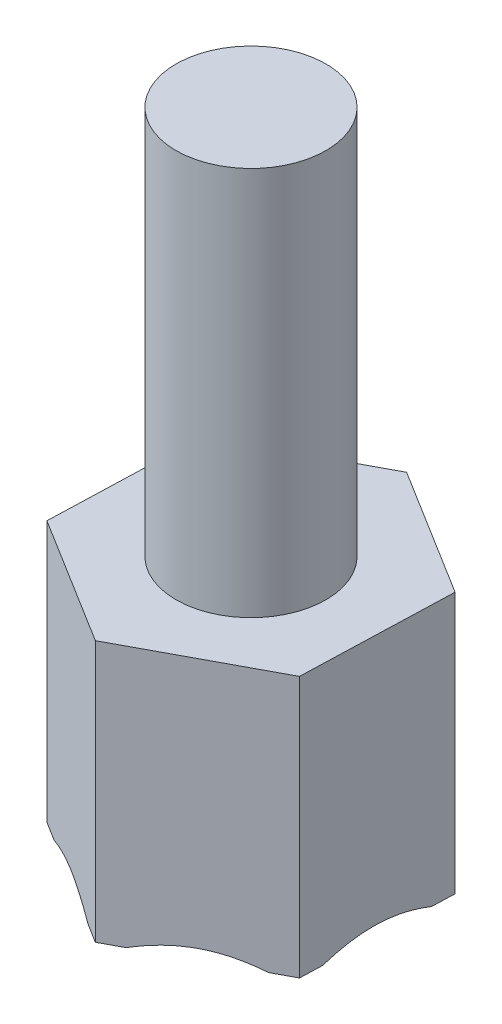
ISO-10303-21;
HEADER;
FILE_DESCRIPTION(('STEP AP214'),'2;1');
FILE_NAME('part.step','',(''),(''),'','','');
FILE_SCHEMA(('AUTOMOTIVE_DESIGN { 1 0 10303 214 1 1 1 1 }'));
ENDSEC;
DATA;
#1=APPLICATION_CONTEXT('core data for automotive mechanical design processes');
#2=APPLICATION_PROTOCOL_DEFINITION('international standard','automotive_design',2000,#1);
#3=PRODUCT_CONTEXT('',#1,'mechanical');
#4=PRODUCT('Part','Part','',(#3));
#5=PRODUCT_RELATED_PRODUCT_CATEGORY('part','',(#4));
#6=PRODUCT_DEFINITION_FORMATION('','',#4);
#7=PRODUCT_DEFINITION_CONTEXT('part definition',#1,'design');
#8=PRODUCT_DEFINITION('design','',#6,#7);
#9=PRODUCT_DEFINITION_SHAPE('','',#8);
#10=(LENGTH_UNIT() NAMED_UNIT(*) SI_UNIT(.MILLI.,.METRE.));
#11=(NAMED_UNIT(*) PLANE_ANGLE_UNIT() SI_UNIT($,.RADIAN.));
#12=(NAMED_UNIT(*) SI_UNIT($,.STERADIAN.) SOLID_ANGLE_UNIT());
#13=UNCERTAINTY_MEASURE_WITH_UNIT(LENGTH_MEASURE(1.E-05),#10,'distance_accuracy_value','');
#14=(GEOMETRIC_REPRESENTATION_CONTEXT(3) GLOBAL_UNCERTAINTY_ASSIGNED_CONTEXT((#13)) GLOBAL_UNIT_ASSIGNED_CONTEXT((#10,
#11,#12)) REPRESENTATION_CONTEXT('',''));
#15=CARTESIAN_POINT('',(0.,0.,0.));
#16=DIRECTION('',(0.,0.,1.));
#17=DIRECTION('',(1.,0.,0.));
#18=AXIS2_PLACEMENT_3D('',#15,#16,#17);
#19=CARTESIAN_POINT('',(2.30462704828819,4.7,1.43248996563041));
#20=DIRECTION('',(0.,1.,0.));
#21=DIRECTION('',(0.,0.,1.));
#22=AXIS2_PLACEMENT_3D('',#19,#20,#21);
#23=PLANE('',#22);
#24=DIRECTION('',(0.881829897555729,0.,-0.471567632240437));
#25=VECTOR('',#24,1.);
#26=CARTESIAN_POINT('',(-0.0882591767581321,4.7,2.71211055288152));
#27=LINE('',#26,#25);
#28=CARTESIAN_POINT('',(-0.0882591767581321,4.7,2.71211055288152));
#29=VERTEX_POINT('',#28);
#30=CARTESIAN_POINT('',(2.30462704828819,4.7,1.43248996563041));
#31=VERTEX_POINT('',#30);
#32=EDGE_CURVE('E159',#29,#31,#27,.T.);
#33=ORIENTED_EDGE('',*,*,#32,.T.);
#34=DIRECTION('',(0.032525399655168,0.,-0.999470909220109));
#35=VECTOR('',#34,1.);
#36=CARTESIAN_POINT('',(2.30462704828819,4.7,1.43248996563041));
#37=LINE('',#36,#35);
#38=CARTESIAN_POINT('',(2.39288622504632,4.7,-1.27962058725112));
#39=VERTEX_POINT('',#38);
#40=EDGE_CURVE('E98',#31,#39,#37,.T.);
#41=ORIENTED_EDGE('',*,*,#40,.T.);
#42=DIRECTION('',(-0.849304497900561,0.,-0.527903276979672));
#43=VECTOR('',#42,1.);
#44=CARTESIAN_POINT('',(2.39288622504632,4.7,-1.27962058725112));
#45=LINE('',#44,#43);
#46=CARTESIAN_POINT('',(0.088259176758134,4.7,-2.71211055288152));
#47=VERTEX_POINT('',#46);
#48=EDGE_CURVE('E114',#39,#47,#45,.T.);
#49=ORIENTED_EDGE('',*,*,#48,.T.);
#50=DIRECTION('',(-0.881829897555729,0.,0.471567632240437));
#51=VECTOR('',#50,1.);
#52=CARTESIAN_POINT('',(0.088259176758134,4.7,-2.71211055288152));
#53=LINE('',#52,#51);
#54=CARTESIAN_POINT('',(-2.30462704828819,4.7,-1.4324899656304));
#55=VERTEX_POINT('',#54);
#56=EDGE_CURVE('E107',#47,#55,#53,.T.);
#57=ORIENTED_EDGE('',*,*,#56,.T.);
#58=DIRECTION('',(-0.0325253996551677,0.,0.999470909220109));
#59=VECTOR('',#58,1.);
#60=CARTESIAN_POINT('',(-2.30462704828819,4.7,-1.4324899656304));
#61=LINE('',#60,#59);
#62=CARTESIAN_POINT('',(-2.39288622504632,4.7,1.27962058725111));
#63=VERTEX_POINT('',#62);
#64=EDGE_CURVE('E111',#55,#63,#61,.T.);
#65=ORIENTED_EDGE('',*,*,#64,.T.);
#66=DIRECTION('',(0.849304497900561,0.,0.527903276979672));
#67=VECTOR('',#66,1.);
#68=CARTESIAN_POINT('',(-2.39288622504632,4.7,1.27962058725111));
#69=LINE('',#68,#67);
#70=EDGE_CURVE('E62',#63,#29,#69,.T.);
#71=ORIENTED_EDGE('',*,*,#70,.T.);
#72=EDGE_LOOP('',(#33,#41,#49,#57,#65,#71));
#73=FACE_BOUND('',#72,.T.);
#74=CARTESIAN_POINT('',(0.,4.7,0.));
#75=DIRECTION('',(0.,1.,0.));
#76=DIRECTION('',(0.,0.,1.));
#77=AXIS2_PLACEMENT_3D('',#74,#75,#76);
#78=CIRCLE('',#77,1.35);
#79=CARTESIAN_POINT('',(0.,4.7,1.35));
#80=VERTEX_POINT('',#79);
#81=EDGE_CURVE('E294',#80,#80,#78,.T.);
#82=ORIENTED_EDGE('',*,*,#81,.F.);
#83=EDGE_LOOP('',(#82));
#84=FACE_BOUND('',#83,.T.);
#85=ADVANCED_FACE('F36',(#73,#84),#23,.T.);
#86=CARTESIAN_POINT('',(2.30462704828819,0.,1.43248996563041));
#87=DIRECTION('',(0.,1.,0.));
#88=DIRECTION('',(0.,0.,1.));
#89=AXIS2_PLACEMENT_3D('',#86,#87,#88);
#90=PLANE('',#89);
#91=DIRECTION('',(0.881829897555729,0.,-0.471567632240437));
#92=VECTOR('',#91,1.);
#93=CARTESIAN_POINT('',(-0.0882591767581321,0.,2.71211055288152));
#94=LINE('',#93,#92);
#95=CARTESIAN_POINT('',(1.94331098636969,0.,1.62570745608024));
#96=VERTEX_POINT('',#95);
#97=CARTESIAN_POINT('',(2.30462704828819,0.,1.43248996563041));
#98=VERTEX_POINT('',#97);
#99=EDGE_CURVE('E143',#96,#98,#94,.T.);
#100=ORIENTED_EDGE('',*,*,#99,.F.);
#101=CARTESIAN_POINT('',(0.,0.,0.));
#102=DIRECTION('',(0.,1.,0.));
#103=DIRECTION('',(0.,0.,1.));
#104=AXIS2_PLACEMENT_3D('',#101,#102,#103);
#105=CIRCLE('',#104,2.53365);
#106=CARTESIAN_POINT('',(2.31795382406241,0.,1.02297233198872));
#107=VERTEX_POINT('',#106);
#108=EDGE_CURVE('E12',#96,#107,#105,.T.);
#109=ORIENTED_EDGE('',*,*,#108,.T.);
#110=DIRECTION('',(0.032525399655168,0.,-0.999470909220109));
#111=VECTOR('',#110,1.);
#112=CARTESIAN_POINT('',(2.30462704828819,0.,1.43248996563041));
#113=LINE('',#112,#111);
#114=EDGE_CURVE('E144',#98,#107,#113,.T.);
#115=ORIENTED_EDGE('',*,*,#114,.F.);
#116=EDGE_LOOP('',(#100,#109,#115));
#117=FACE_BOUND('',#116,.T.);
#118=ADVANCED_FACE('F274',(#117),#90,.F.);
#119=CARTESIAN_POINT('',(2.3795594492721,0.,-0.87010295360943));
#120=VERTEX_POINT('',#119);
#121=CARTESIAN_POINT('',(2.39288622504632,0.,-1.27962058725112));
#122=VERTEX_POINT('',#121);
#123=EDGE_CURVE('E142',#120,#122,#113,.T.);
#124=ORIENTED_EDGE('',*,*,#123,.F.);
#125=CARTESIAN_POINT('',(2.04489693890204,0.,-1.49592073044298));
#126=VERTEX_POINT('',#125);
#127=EDGE_CURVE('E46',#120,#126,#105,.T.);
#128=ORIENTED_EDGE('',*,*,#127,.T.);
#129=DIRECTION('',(-0.849304497900561,0.,-0.527903276979672));
#130=VECTOR('',#129,1.);
#131=CARTESIAN_POINT('',(2.39288622504632,0.,-1.27962058725112));
#132=LINE('',#131,#130);
#133=EDGE_CURVE('E148',#122,#126,#132,.T.);
#134=ORIENTED_EDGE('',*,*,#133,.F.);
#135=EDGE_LOOP('',(#124,#128,#134));
#136=FACE_BOUND('',#135,.T.);
#137=ADVANCED_FACE('F193',(#136),#90,.F.);
#138=CARTESIAN_POINT('',(0.436248462902413,0.,-2.49581040968966));
#139=VERTEX_POINT('',#138);
#140=CARTESIAN_POINT('',(0.088259176758134,0.,-2.71211055288152));
#141=VERTEX_POINT('',#140);
#142=EDGE_CURVE('E147',#139,#141,#132,.T.);
#143=ORIENTED_EDGE('',*,*,#142,.F.);
#144=CARTESIAN_POINT('',(-0.273056885160367,0.,-2.51889306243169));
#145=VERTEX_POINT('',#144);
#146=EDGE_CURVE('E178',#139,#145,#105,.T.);
#147=ORIENTED_EDGE('',*,*,#146,.T.);
#148=DIRECTION('',(-0.881829897555729,0.,0.471567632240437));
#149=VECTOR('',#148,1.);
#150=CARTESIAN_POINT('',(0.088259176758134,0.,-2.71211055288152));
#151=LINE('',#150,#149);
#152=EDGE_CURVE('E151',#141,#145,#151,.T.);
#153=ORIENTED_EDGE('',*,*,#152,.F.);
#154=EDGE_LOOP('',(#143,#147,#153));
#155=FACE_BOUND('',#154,.T.);
#156=ADVANCED_FACE('F365',(#155),#90,.F.);
#157=CARTESIAN_POINT('',(-1.94331098636969,0.,-1.62570745608023));
#158=VERTEX_POINT('',#157);
#159=CARTESIAN_POINT('',(-2.30462704828819,0.,-1.4324899656304));
#160=VERTEX_POINT('',#159);
#161=EDGE_CURVE('E125',#158,#160,#151,.T.);
#162=ORIENTED_EDGE('',*,*,#161,.F.);
#163=CARTESIAN_POINT('',(-2.31795382406241,0.,-1.02297233198872));
#164=VERTEX_POINT('',#163);
#165=EDGE_CURVE('E171',#158,#164,#105,.T.);
#166=ORIENTED_EDGE('',*,*,#165,.T.);
#167=DIRECTION('',(-0.0325253996551677,0.,0.999470909220109));
#168=VECTOR('',#167,1.);
#169=CARTESIAN_POINT('',(-2.30462704828819,0.,-1.4324899656304));
#170=LINE('',#169,#168);
#171=EDGE_CURVE('E154',#160,#164,#170,.T.);
#172=ORIENTED_EDGE('',*,*,#171,.F.);
#173=EDGE_LOOP('',(#162,#166,#172));
#174=FACE_BOUND('',#173,.T.);
#175=ADVANCED_FACE('F359',(#174),#90,.F.);
#176=CARTESIAN_POINT('',(-2.3795594492721,0.,0.870102953609432));
#177=VERTEX_POINT('',#176);
#178=CARTESIAN_POINT('',(-2.39288622504632,0.,1.27962058725111));
#179=VERTEX_POINT('',#178);
#180=EDGE_CURVE('E153',#177,#179,#170,.T.);
#181=ORIENTED_EDGE('',*,*,#180,.F.);
#182=CARTESIAN_POINT('',(-2.04489693890205,0.,1.49592073044297));
#183=VERTEX_POINT('',#182);
#184=EDGE_CURVE('E167',#177,#183,#105,.T.);
#185=ORIENTED_EDGE('',*,*,#184,.T.);
#186=DIRECTION('',(0.849304497900561,0.,0.527903276979672));
#187=VECTOR('',#186,1.);
#188=CARTESIAN_POINT('',(-2.39288622504632,0.,1.27962058725111));
#189=LINE('',#188,#187);
#190=EDGE_CURVE('E156',#179,#183,#189,.T.);
#191=ORIENTED_EDGE('',*,*,#190,.F.);
#192=EDGE_LOOP('',(#181,#185,#191));
#193=FACE_BOUND('',#192,.T.);
#194=ADVANCED_FACE('F275',(#193),#90,.F.);
#195=CARTESIAN_POINT('',(-0.0882591767581321,4.7,2.71211055288152));
#196=DIRECTION('',(-0.471567632240437,0.,-0.881829897555729));
#197=DIRECTION('',(-0.881829897555729,0.,0.471567632240438));
#198=AXIS2_PLACEMENT_3D('',#195,#196,#197);
#199=PLANE('',#198);
#200=CARTESIAN_POINT('',(-0.0882591767581321,0.,2.71211055288152));
#201=VERTEX_POINT('',#200);
#202=CARTESIAN_POINT('',(0.273056885160369,0.,2.51889306243169));
#203=VERTEX_POINT('',#202);
#204=EDGE_CURVE('E139',#201,#203,#94,.T.);
#205=ORIENTED_EDGE('',*,*,#204,.T.);
#206=CARTESIAN_POINT('',(0.272585160907464,-0.000200000000007731,2.51914532184094));
#207=CARTESIAN_POINT('',(0.33941374496188,0.0281606962445841,2.48340804729868));
#208=CARTESIAN_POINT('',(0.407169508592656,0.0539533673700446,2.44717495391573));
#209=CARTESIAN_POINT('',(0.544442305642624,0.0993822849957582,2.3737669099661));
#210=CARTESIAN_POINT('',(0.613963366016231,0.119002770077137,2.336589805944));
#211=CARTESIAN_POINT('',(0.751866766354323,0.150351770559974,2.26284454038247));
#212=CARTESIAN_POINT('',(0.820203310779621,0.162333319790776,2.22630086847993));
#213=CARTESIAN_POINT('',(0.95750326469905,0.178715432857798,2.15287830211427));
#214=CARTESIAN_POINT('',(1.02646577430455,0.183125544334705,2.11599988887589));
#215=CARTESIAN_POINT('',(1.16647929440919,0.184099955451445,2.04112621500703));
#216=CARTESIAN_POINT('',(1.23753169105231,0.180428109206903,2.00313021312177));
#217=CARTESIAN_POINT('',(1.37903638452598,0.165011986207744,1.927459118915));
#218=CARTESIAN_POINT('',(1.4494877388511,0.15325678907638,1.88978453060799));
#219=CARTESIAN_POINT('',(1.59172162468689,0.12187068465535,1.81372349326524));
#220=CARTESIAN_POINT('',(1.66345514284662,0.101961216382188,1.7753632546244));
#221=CARTESIAN_POINT('',(1.80504743431441,0.0555327956966506,1.69964531648686));
#222=CARTESIAN_POINT('',(1.87491065022688,0.0290314007126756,1.66228524126162));
#223=CARTESIAN_POINT('',(1.94378271062257,-0.000200000000000018,1.625455196671));
#224=B_SPLINE_CURVE_WITH_KNOTS('',3,(#206,#207,#208,#209,#210,#211,#212,#213,#214,#215,#216,
#217,#218,#219,#220,#221,#222,#223),.UNSPECIFIED.,.F.,.F.,(4,2,2,2,2,2,2,2,4),(0.,
0.242832593110272,0.486280347118683,0.721175672886601,0.955774575702409,1.19731893403296,
1.4391902546708,1.69012319461926,1.94039480661336),.UNSPECIFIED.);
#225=EDGE_CURVE('E53',#203,#96,#224,.T.);
#226=ORIENTED_EDGE('',*,*,#225,.T.);
#227=ORIENTED_EDGE('',*,*,#99,.T.);
#228=DIRECTION('',(0.,-1.,0.));
#229=VECTOR('',#228,1.);
#230=CARTESIAN_POINT('',(2.30462704828819,4.7,1.43248996563041));
#231=LINE('',#230,#229);
#232=EDGE_CURVE('E165',#31,#98,#231,.T.);
#233=ORIENTED_EDGE('',*,*,#232,.F.);
#234=ORIENTED_EDGE('',*,*,#32,.F.);
#235=DIRECTION('',(0.,-1.,0.));
#236=VECTOR('',#235,1.);
#237=CARTESIAN_POINT('',(-0.0882591767581321,4.7,2.71211055288152));
#238=LINE('',#237,#236);
#239=EDGE_CURVE('E135',#29,#201,#238,.T.);
#240=ORIENTED_EDGE('',*,*,#239,.T.);
#241=EDGE_LOOP('',(#205,#226,#227,#233,#234,#240));
#242=FACE_BOUND('',#241,.T.);
#243=ADVANCED_FACE('F38',(#242),#199,.F.);
#244=CARTESIAN_POINT('',(2.30462704828819,4.7,1.43248996563041));
#245=DIRECTION('',(-0.999470909220109,0.,-0.032525399655168));
#246=DIRECTION('',(-0.032525399655168,0.,0.999470909220109));
#247=AXIS2_PLACEMENT_3D('',#244,#245,#246);
#248=PLANE('',#247);
#249=ORIENTED_EDGE('',*,*,#114,.T.);
#250=CARTESIAN_POINT('',(2.3179364249927,-0.000200000000083292,1.02350698688014));
#251=CARTESIAN_POINT('',(2.32040132940429,0.0281606962445167,0.947763098118933));
#252=CARTESIAN_POINT('',(2.32290043189236,0.0539533673699859,0.870968338870386));
#253=CARTESIAN_POINT('',(2.32796359951483,0.0993822849957162,0.715382587401729));
#254=CARTESIAN_POINT('',(2.33052781317936,0.119002770077103,0.636587031009093));
#255=CARTESIAN_POINT('',(2.3356142399633,0.150351770559952,0.480286550267273));
#256=CARTESIAN_POINT('',(2.33813476396078,0.162333319790758,0.402833530836844));
#257=CARTESIAN_POINT('',(2.34319893323679,0.178715432857789,0.247216999621348));
#258=CARTESIAN_POINT('',(2.34574254532384,0.183125544334702,0.169054507775062));
#259=CARTESIAN_POINT('',(2.35090680173107,0.184099955451452,0.0103624055562354));
#260=CARTESIAN_POINT('',(2.35352749717777,0.180428109206866,-0.0701687758795786));
#261=CARTESIAN_POINT('',(2.35874675399941,0.165011986207525,-0.230550982286859));
#262=CARTESIAN_POINT('',(2.36134528061099,0.153256789076022,-0.31040093901741));
#263=CARTESIAN_POINT('',(2.3665914329519,0.121870684654627,-0.471609616102519));
#264=CARTESIAN_POINT('',(2.36923725087358,0.101961216381232,-0.55291278445259));
#265=CARTESIAN_POINT('',(2.37445973865821,0.0555327956951676,-0.713394274913463));
#266=CARTESIAN_POINT('',(2.37703657238211,0.0290314007108982,-0.792577632296816));
#267=CARTESIAN_POINT('',(2.37957684834198,-0.000200000002091598,-0.870637608506218));
#268=B_SPLINE_CURVE_WITH_KNOTS('',3,(#250,#251,#252,#253,#254,#255,#256,#257,#258,#259,#260,
#261,#262,#263,#264,#265,#266,#267),.UNSPECIFIED.,.F.,.F.,(4,2,2,2,2,2,2,2,4),(0.,
0.242832593110308,0.486280347118756,0.721175672886689,0.955774575702512,1.19731893403451,
1.43919025467382,1.69012319462387,1.94039480661954),.UNSPECIFIED.);
#269=EDGE_CURVE('E205',#107,#120,#268,.T.);
#270=ORIENTED_EDGE('',*,*,#269,.T.);
#271=ORIENTED_EDGE('',*,*,#123,.T.);
#272=DIRECTION('',(0.,-1.,0.));
#273=VECTOR('',#272,1.);
#274=CARTESIAN_POINT('',(2.39288622504632,4.7,-1.27962058725112));
#275=LINE('',#274,#273);
#276=EDGE_CURVE('E163',#39,#122,#275,.T.);
#277=ORIENTED_EDGE('',*,*,#276,.F.);
#278=ORIENTED_EDGE('',*,*,#40,.F.);
#279=ORIENTED_EDGE('',*,*,#232,.T.);
#280=EDGE_LOOP('',(#249,#270,#271,#277,#278,#279));
#281=FACE_BOUND('',#280,.T.);
#282=ADVANCED_FACE('F204',(#281),#248,.F.);
#283=CARTESIAN_POINT('',(2.39288622504632,4.7,-1.27962058725112));
#284=DIRECTION('',(-0.527903276979672,0.,0.849304497900561));
#285=DIRECTION('',(0.849304497900561,0.,0.527903276979672));
#286=AXIS2_PLACEMENT_3D('',#283,#284,#285);
#287=PLANE('',#286);
#288=ORIENTED_EDGE('',*,*,#133,.T.);
#289=CARTESIAN_POINT('',(2.04535126408523,-0.000200000000000078,-1.49563833496101));
#290=CARTESIAN_POINT('',(1.9809875844424,0.0281606962445906,-1.53564494917995));
#291=CARTESIAN_POINT('',(1.9157309232997,0.0539533673700504,-1.57620661504554));
#292=CARTESIAN_POINT('',(1.7835212938722,0.0993822849957628,-1.65838432256454));
#293=CARTESIAN_POINT('',(1.71656444716312,0.119002770077141,-1.70000277493507));
#294=CARTESIAN_POINT('',(1.58374747360897,0.150351770559977,-1.78255799011535));
#295=CARTESIAN_POINT('',(1.51793145318115,0.162333319790778,-1.82346733764323));
#296=CARTESIAN_POINT('',(1.38569566853773,0.178715432857798,-1.90566130249306));
#297=CARTESIAN_POINT('',(1.31927677101928,0.183125544334706,-1.94694538110095));
#298=CARTESIAN_POINT('',(1.18442750732186,0.184099955451445,-2.03076380945043));
#299=CARTESIAN_POINT('',(1.11599580612543,0.180428109206902,-2.0732989890005));
#300=CARTESIAN_POINT('',(0.979710369473362,0.165011986207743,-2.15801010120005));
#301=CARTESIAN_POINT('',(0.911857541759811,0.153256789076378,-2.20018546962311));
#302=CARTESIAN_POINT('',(0.7748698082649,0.121870684655349,-2.28533310936451));
#303=CARTESIAN_POINT('',(0.705782108026837,0.101961216382187,-2.32827603907325));
#304=CARTESIAN_POINT('',(0.569412304343654,0.0555327956966502,-2.41303959139563));
#305=CARTESIAN_POINT('',(0.502125922155066,0.0290314007126754,-2.45486287355328));
#306=CARTESIAN_POINT('',(0.435794137719228,-0.000200000000000016,-2.49609280517162));
#307=B_SPLINE_CURVE_WITH_KNOTS('',3,(#289,#290,#291,#292,#293,#294,#295,#296,#297,#298,#299,
#300,#301,#302,#303,#304,#305,#306),.UNSPECIFIED.,.F.,.F.,(4,2,2,2,2,2,2,2,4),(0.,
0.24283259311027,0.486280347118679,0.721175672886594,0.9557745757024,1.19731893403294,
1.43919025467079,1.69012319461925,1.94039480661334),.UNSPECIFIED.);
#308=EDGE_CURVE('E203',#126,#139,#307,.T.);
#309=ORIENTED_EDGE('',*,*,#308,.T.);
#310=ORIENTED_EDGE('',*,*,#142,.T.);
#311=DIRECTION('',(0.,-1.,0.));
#312=VECTOR('',#311,1.);
#313=CARTESIAN_POINT('',(0.088259176758134,4.7,-2.71211055288152));
#314=LINE('',#313,#312);
#315=EDGE_CURVE('E129',#47,#141,#314,.T.);
#316=ORIENTED_EDGE('',*,*,#315,.F.);
#317=ORIENTED_EDGE('',*,*,#48,.F.);
#318=ORIENTED_EDGE('',*,*,#276,.T.);
#319=EDGE_LOOP('',(#288,#309,#310,#316,#317,#318));
#320=FACE_BOUND('',#319,.T.);
#321=ADVANCED_FACE('F202',(#320),#287,.F.);
#322=CARTESIAN_POINT('',(0.088259176758134,4.7,-2.71211055288152));
#323=DIRECTION('',(0.471567632240437,0.,0.881829897555729));
#324=DIRECTION('',(0.881829897555729,0.,-0.471567632240437));
#325=AXIS2_PLACEMENT_3D('',#322,#323,#324);
#326=PLANE('',#325);
#327=ORIENTED_EDGE('',*,*,#152,.T.);
#328=CARTESIAN_POINT('',(-0.272585160907462,-0.000200000000007842,-2.51914532184094));
#329=CARTESIAN_POINT('',(-0.339413744961878,0.0281606962445838,-2.48340804729868));
#330=CARTESIAN_POINT('',(-0.407169508592654,0.0539533673700445,-2.44717495391574));
#331=CARTESIAN_POINT('',(-0.544442305642622,0.0993822849957586,-2.3737669099661));
#332=CARTESIAN_POINT('',(-0.613963366016229,0.119002770077138,-2.336589805944));
#333=CARTESIAN_POINT('',(-0.75186676635432,0.150351770559975,-2.26284454038247));
#334=CARTESIAN_POINT('',(-0.820203310779619,0.162333319790776,-2.22630086847993));
#335=CARTESIAN_POINT('',(-0.957503264699048,0.178715432857798,-2.15287830211427));
#336=CARTESIAN_POINT('',(-1.02646577430455,0.183125544334706,-2.11599988887589));
#337=CARTESIAN_POINT('',(-1.16647929440919,0.184099955451446,-2.04112621500703));
#338=CARTESIAN_POINT('',(-1.2375316910523,0.180428109206903,-2.00313021312177));
#339=CARTESIAN_POINT('',(-1.37903638452598,0.165011986207745,-1.927459118915));
#340=CARTESIAN_POINT('',(-1.4494877388511,0.15325678907638,-1.88978453060799));
#341=CARTESIAN_POINT('',(-1.59172162468689,0.121870684655351,-1.81372349326524));
#342=CARTESIAN_POINT('',(-1.66345514284662,0.101961216382189,-1.7753632546244));
#343=CARTESIAN_POINT('',(-1.80504743431441,0.0555327956966509,-1.69964531648685));
#344=CARTESIAN_POINT('',(-1.87491065022688,0.0290314007126756,-1.66228524126162));
#345=CARTESIAN_POINT('',(-1.94378271062257,-0.000200000000000048,-1.625455196671));
#346=B_SPLINE_CURVE_WITH_KNOTS('',3,(#328,#329,#330,#331,#332,#333,#334,#335,#336,#337,#338,
#339,#340,#341,#342,#343,#344,#345),.UNSPECIFIED.,.F.,.F.,(4,2,2,2,2,2,2,2,4),(0.,
0.242832593110273,0.486280347118684,0.721175672886602,0.95577457570241,1.19731893403296,
1.43919025467081,1.69012319461927,1.94039480661336),.UNSPECIFIED.);
#347=EDGE_CURVE('E254',#145,#158,#346,.T.);
#348=ORIENTED_EDGE('',*,*,#347,.T.);
#349=ORIENTED_EDGE('',*,*,#161,.T.);
#350=DIRECTION('',(0.,-1.,0.));
#351=VECTOR('',#350,1.);
#352=CARTESIAN_POINT('',(-2.30462704828819,4.7,-1.4324899656304));
#353=LINE('',#352,#351);
#354=EDGE_CURVE('E120',#55,#160,#353,.T.);
#355=ORIENTED_EDGE('',*,*,#354,.F.);
#356=ORIENTED_EDGE('',*,*,#56,.F.);
#357=ORIENTED_EDGE('',*,*,#315,.T.);
#358=EDGE_LOOP('',(#327,#348,#349,#355,#356,#357));
#359=FACE_BOUND('',#358,.T.);
#360=ADVANCED_FACE('F122',(#359),#326,.F.);
#361=CARTESIAN_POINT('',(-2.30462704828819,4.7,-1.4324899656304));
#362=DIRECTION('',(0.999470909220109,0.,0.0325253996551677));
#363=DIRECTION('',(0.0325253996551677,0.,-0.999470909220109));
#364=AXIS2_PLACEMENT_3D('',#361,#362,#363);
#365=PLANE('',#364);
#366=ORIENTED_EDGE('',*,*,#171,.T.);
#367=CARTESIAN_POINT('',(-2.3179364249927,-0.000200000000083507,-1.02350698688014));
#368=CARTESIAN_POINT('',(-2.32040132940429,0.0281606962445171,-0.947763098118934));
#369=CARTESIAN_POINT('',(-2.32290043189236,0.0539533673699863,-0.870968338870387));
#370=CARTESIAN_POINT('',(-2.32796359951483,0.0993822849957163,-0.71538258740173));
#371=CARTESIAN_POINT('',(-2.33052781317936,0.119002770077103,-0.636587031009094));
#372=CARTESIAN_POINT('',(-2.3356142399633,0.150351770559952,-0.480286550267274));
#373=CARTESIAN_POINT('',(-2.33813476396078,0.162333319790758,-0.402833530836845));
#374=CARTESIAN_POINT('',(-2.34319893323679,0.17871543285779,-0.247216999621349));
#375=CARTESIAN_POINT('',(-2.34574254532384,0.183125544334702,-0.169054507775062));
#376=CARTESIAN_POINT('',(-2.35090680173107,0.184099955451452,-0.0103624055562359));
#377=CARTESIAN_POINT('',(-2.35352749717777,0.180428109206866,0.0701687758795783));
#378=CARTESIAN_POINT('',(-2.35874675399941,0.165011986207526,0.23055098228686));
#379=CARTESIAN_POINT('',(-2.36134528061099,0.153256789076023,0.31040093901741));
#380=CARTESIAN_POINT('',(-2.3665914329519,0.121870684654627,0.47160961610252));
#381=CARTESIAN_POINT('',(-2.36923725087358,0.101961216381233,0.552912784452591));
#382=CARTESIAN_POINT('',(-2.37445973865821,0.0555327956951677,0.713394274913464));
#383=CARTESIAN_POINT('',(-2.37703657238211,0.0290314007108983,0.792577632296818));
#384=CARTESIAN_POINT('',(-2.37957684834198,-0.000200000002091408,0.870637608506219));
#385=B_SPLINE_CURVE_WITH_KNOTS('',3,(#367,#368,#369,#370,#371,#372,#373,#374,#375,#376,#377,
#378,#379,#380,#381,#382,#383,#384),.UNSPECIFIED.,.F.,.F.,(4,2,2,2,2,2,2,2,4),(0.,
0.242832593110308,0.486280347118756,0.721175672886689,0.955774575702512,1.19731893403451,
1.43919025467382,1.69012319462388,1.94039480661955),.UNSPECIFIED.);
#386=EDGE_CURVE('E247',#164,#177,#385,.T.);
#387=ORIENTED_EDGE('',*,*,#386,.T.);
#388=ORIENTED_EDGE('',*,*,#180,.T.);
#389=DIRECTION('',(0.,-1.,0.));
#390=VECTOR('',#389,1.);
#391=CARTESIAN_POINT('',(-2.39288622504632,4.7,1.27962058725111));
#392=LINE('',#391,#390);
#393=EDGE_CURVE('E130',#63,#179,#392,.T.);
#394=ORIENTED_EDGE('',*,*,#393,.F.);
#395=ORIENTED_EDGE('',*,*,#64,.F.);
#396=ORIENTED_EDGE('',*,*,#354,.T.);
#397=EDGE_LOOP('',(#366,#387,#388,#394,#395,#396));
#398=FACE_BOUND('',#397,.T.);
#399=ADVANCED_FACE('F132',(#398),#365,.F.);
#400=CARTESIAN_POINT('',(-2.39288622504632,4.7,1.27962058725111));
#401=DIRECTION('',(0.527903276979672,0.,-0.849304497900561));
#402=DIRECTION('',(-0.849304497900561,0.,-0.527903276979672));
#403=AXIS2_PLACEMENT_3D('',#400,#401,#402);
#404=PLANE('',#403);
#405=ORIENTED_EDGE('',*,*,#190,.T.);
#406=CARTESIAN_POINT('',(-2.04535126408529,-0.000200000000025569,1.49563833496097));
#407=CARTESIAN_POINT('',(-1.98098758444246,0.0281606962445681,1.53564494917991));
#408=CARTESIAN_POINT('',(-1.91573092329975,0.0539533673700307,1.57620661504551));
#409=CARTESIAN_POINT('',(-1.78352129387225,0.0993822849957482,1.65838432256451));
#410=CARTESIAN_POINT('',(-1.71656444716317,0.119002770077129,1.70000277493504));
#411=CARTESIAN_POINT('',(-1.58374747360901,0.150351770559969,1.78255799011532));
#412=CARTESIAN_POINT('',(-1.5179314531812,0.162333319790772,1.8234673376432));
#413=CARTESIAN_POINT('',(-1.38569566853777,0.178715432857797,1.90566130249303));
#414=CARTESIAN_POINT('',(-1.31927677101932,0.183125544334705,1.94694538110093));
#415=CARTESIAN_POINT('',(-1.18442750732189,0.184099955451447,2.03076380945041));
#416=CARTESIAN_POINT('',(-1.11599580612546,0.180428109206906,2.07329898900048));
#417=CARTESIAN_POINT('',(-0.979710369473384,0.165011986207748,2.15801010120003));
#418=CARTESIAN_POINT('',(-0.91185754175983,0.153256789076384,2.2001854696231));
#419=CARTESIAN_POINT('',(-0.774869808264913,0.121870684655354,2.2853331093645));
#420=CARTESIAN_POINT('',(-0.705782108026847,0.101961216382192,2.32827603907324));
#421=CARTESIAN_POINT('',(-0.569412304343658,0.0555327956966527,2.41303959139562));
#422=CARTESIAN_POINT('',(-0.502125922155066,0.0290314007126767,2.45486287355328));
#423=CARTESIAN_POINT('',(-0.435794137719225,-0.000200000000000018,2.49609280517162));
#424=B_SPLINE_CURVE_WITH_KNOTS('',3,(#406,#407,#408,#409,#410,#411,#412,#413,#414,#415,#416,
#417,#418,#419,#420,#421,#422,#423),.UNSPECIFIED.,.F.,.F.,(4,2,2,2,2,2,2,2,4),(0.,
0.242832593110279,0.486280347118697,0.721175672886621,0.955774575702435,1.19731893403299,
1.43919025467084,1.69012319461931,1.94039480661342),.UNSPECIFIED.);
#425=CARTESIAN_POINT('',(-0.436248462902411,0.,2.49581040968966));
#426=VERTEX_POINT('',#425);
#427=EDGE_CURVE('E238',#183,#426,#424,.T.);
#428=ORIENTED_EDGE('',*,*,#427,.T.);
#429=EDGE_CURVE('E89',#426,#201,#189,.T.);
#430=ORIENTED_EDGE('',*,*,#429,.T.);
#431=ORIENTED_EDGE('',*,*,#239,.F.);
#432=ORIENTED_EDGE('',*,*,#70,.F.);
#433=ORIENTED_EDGE('',*,*,#393,.T.);
#434=EDGE_LOOP('',(#405,#428,#430,#431,#432,#433));
#435=FACE_BOUND('',#434,.T.);
#436=ADVANCED_FACE('F268',(#435),#404,.F.);
#437=ORIENTED_EDGE('',*,*,#429,.F.);
#438=EDGE_CURVE('E41',#426,#203,#105,.T.);
#439=ORIENTED_EDGE('',*,*,#438,.T.);
#440=ORIENTED_EDGE('',*,*,#204,.F.);
#441=EDGE_LOOP('',(#437,#439,#440));
#442=FACE_BOUND('',#441,.T.);
#443=ADVANCED_FACE('F229',(#442),#90,.F.);
#444=CARTESIAN_POINT('',(0.,0.,0.));
#445=DIRECTION('',(0.,-1.,0.));
#446=DIRECTION('',(0.,0.,-1.));
#447=AXIS2_PLACEMENT_3D('',#444,#445,#446);
#448=CONICAL_SURFACE('',#447,2.53365,0.785398163397447);
#449=CARTESIAN_POINT('',(0.,0.635000000000001,0.));
#450=DIRECTION('',(0.,-1.,0.));
#451=DIRECTION('',(0.,0.,-1.));
#452=AXIS2_PLACEMENT_3D('',#449,#450,#451);
#453=CIRCLE('',#452,1.89865);
#454=CARTESIAN_POINT('',(0.,0.635000000000001,-1.89865));
#455=VERTEX_POINT('',#454);
#456=EDGE_CURVE('E287',#455,#455,#453,.T.);
#457=ORIENTED_EDGE('',*,*,#456,.F.);
#458=EDGE_LOOP('',(#457));
#459=FACE_BOUND('',#458,.T.);
#460=ORIENTED_EDGE('',*,*,#108,.F.);
#461=ORIENTED_EDGE('',*,*,#225,.F.);
#462=ORIENTED_EDGE('',*,*,#438,.F.);
#463=ORIENTED_EDGE('',*,*,#427,.F.);
#464=ORIENTED_EDGE('',*,*,#184,.F.);
#465=ORIENTED_EDGE('',*,*,#386,.F.);
#466=ORIENTED_EDGE('',*,*,#165,.F.);
#467=ORIENTED_EDGE('',*,*,#347,.F.);
#468=ORIENTED_EDGE('',*,*,#146,.F.);
#469=ORIENTED_EDGE('',*,*,#308,.F.);
#470=ORIENTED_EDGE('',*,*,#127,.F.);
#471=ORIENTED_EDGE('',*,*,#269,.F.);
#472=EDGE_LOOP('',(#460,#461,#462,#463,#464,#465,#466,#467,#468,#469,#470,#471));
#473=FACE_BOUND('',#472,.T.);
#474=ADVANCED_FACE('F223',(#459,#473),#448,.F.);
#475=CARTESIAN_POINT('',(0.,4.,0.));
#476=DIRECTION('',(0.,1.,0.));
#477=DIRECTION('',(0.,0.,1.));
#478=AXIS2_PLACEMENT_3D('',#475,#476,#477);
#479=PLANE('',#478);
#480=CARTESIAN_POINT('',(0.,4.,0.));
#481=DIRECTION('',(0.,-1.,0.));
#482=DIRECTION('',(0.,0.,-1.));
#483=AXIS2_PLACEMENT_3D('',#480,#481,#482);
#484=CIRCLE('',#483,1.89864999999999);
#485=CARTESIAN_POINT('',(0.,4.,-1.89864999999999));
#486=VERTEX_POINT('',#485);
#487=EDGE_CURVE('E286',#486,#486,#484,.T.);
#488=ORIENTED_EDGE('',*,*,#487,.T.);
#489=EDGE_LOOP('',(#488));
#490=FACE_BOUND('',#489,.T.);
#491=ADVANCED_FACE('F228',(#490),#479,.F.);
#492=CARTESIAN_POINT('',(0.,0.,0.));
#493=DIRECTION('',(0.,-1.,0.));
#494=DIRECTION('',(0.,0.,-1.));
#495=AXIS2_PLACEMENT_3D('',#492,#493,#494);
#496=CYLINDRICAL_SURFACE('',#495,1.89864999999999);
#497=ORIENTED_EDGE('',*,*,#487,.F.);
#498=EDGE_LOOP('',(#497));
#499=FACE_BOUND('',#498,.T.);
#500=ORIENTED_EDGE('',*,*,#456,.T.);
#501=EDGE_LOOP('',(#500));
#502=FACE_BOUND('',#501,.T.);
#503=ADVANCED_FACE('F233',(#499,#502),#496,.F.);
#504=CARTESIAN_POINT('',(0.,27.2183766184074,0.));
#505=DIRECTION('',(0.,-1.,0.));
#506=DIRECTION('',(0.,0.,-1.));
#507=AXIS2_PLACEMENT_3D('',#504,#505,#506);
#508=CYLINDRICAL_SURFACE('',#507,1.35);
#509=ORIENTED_EDGE('',*,*,#81,.T.);
#510=EDGE_LOOP('',(#509));
#511=FACE_BOUND('',#510,.T.);
#512=CARTESIAN_POINT('',(0.,11.7,0.));
#513=DIRECTION('',(0.,1.,0.));
#514=DIRECTION('',(0.,0.,1.));
#515=AXIS2_PLACEMENT_3D('',#512,#513,#514);
#516=CIRCLE('',#515,1.35);
#517=CARTESIAN_POINT('',(0.,11.7,1.35));
#518=VERTEX_POINT('',#517);
#519=EDGE_CURVE('E289',#518,#518,#516,.T.);
#520=ORIENTED_EDGE('',*,*,#519,.F.);
#521=EDGE_LOOP('',(#520));
#522=FACE_BOUND('',#521,.T.);
#523=ADVANCED_FACE('F282',(#511,#522),#508,.T.);
#524=CARTESIAN_POINT('',(2.30462704828819,11.7,1.43248996563041));
#525=DIRECTION('',(0.,1.,0.));
#526=DIRECTION('',(0.,0.,1.));
#527=AXIS2_PLACEMENT_3D('',#524,#525,#526);
#528=PLANE('',#527);
#529=ORIENTED_EDGE('',*,*,#519,.T.);
#530=EDGE_LOOP('',(#529));
#531=FACE_BOUND('',#530,.T.);
#532=ADVANCED_FACE('F231',(#531),#528,.T.);
#533=CLOSED_SHELL('',(#85,#118,#137,#156,#175,#194,#243,#282,#321,#360,#399,#436,#443,#474,#491,
#503,#523,#532));
#534=MANIFOLD_SOLID_BREP('B2',#533);
#535=ADVANCED_BREP_SHAPE_REPRESENTATION('',(#18,#534),#14);
#536=SHAPE_DEFINITION_REPRESENTATION(#9,#535);
ENDSEC;
END-ISO-10303-21;
